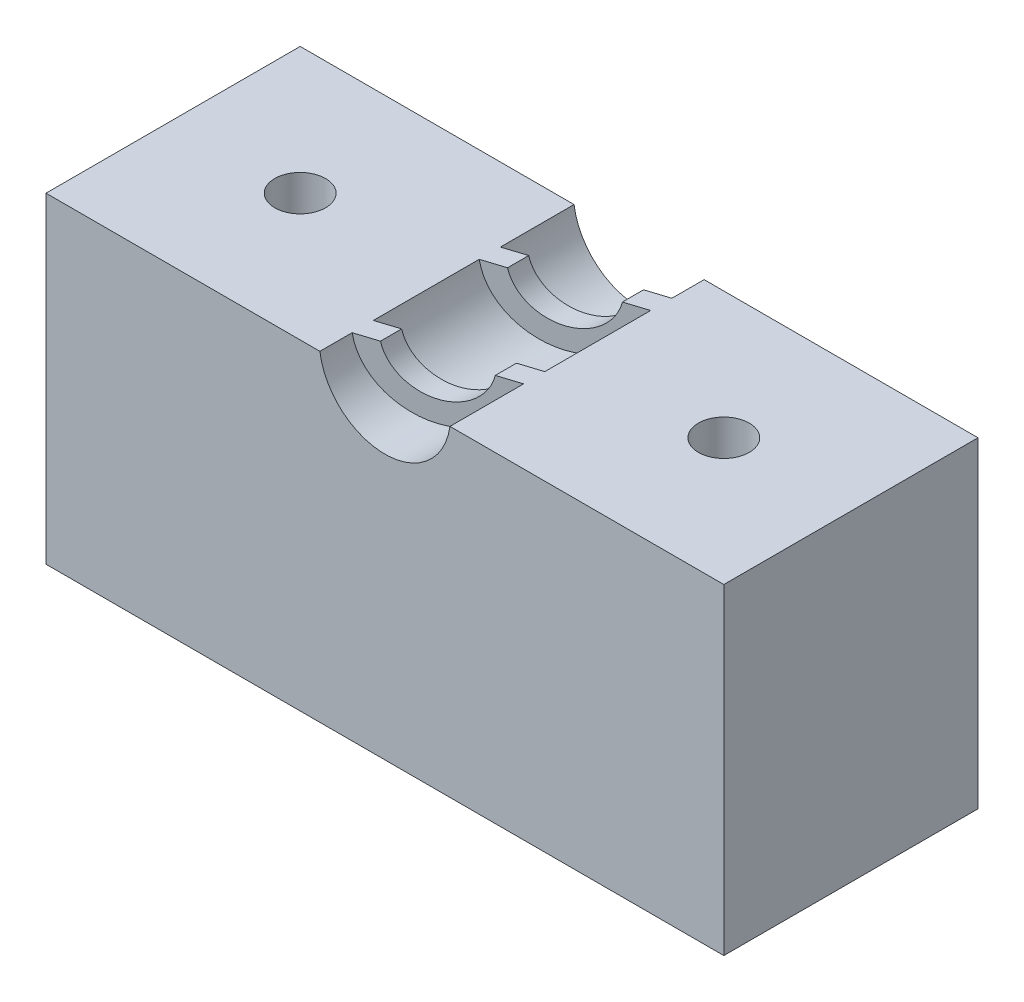
ISO-10303-21;
HEADER;
FILE_DESCRIPTION(('STEP AP214'),'2;1');
FILE_NAME('part.step','',(''),(''),'','','');
FILE_SCHEMA(('AUTOMOTIVE_DESIGN { 1 0 10303 214 1 1 1 1 }'));
ENDSEC;
DATA;
#1=APPLICATION_CONTEXT('core data for automotive mechanical design processes');
#2=APPLICATION_PROTOCOL_DEFINITION('international standard','automotive_design',2000,#1);
#3=PRODUCT_CONTEXT('',#1,'mechanical');
#4=PRODUCT('Part','Part','',(#3));
#5=PRODUCT_RELATED_PRODUCT_CATEGORY('part','',(#4));
#6=PRODUCT_DEFINITION_FORMATION('','',#4);
#7=PRODUCT_DEFINITION_CONTEXT('part definition',#1,'design');
#8=PRODUCT_DEFINITION('design','',#6,#7);
#9=PRODUCT_DEFINITION_SHAPE('','',#8);
#10=(LENGTH_UNIT() NAMED_UNIT(*) SI_UNIT(.MILLI.,.METRE.));
#11=(NAMED_UNIT(*) PLANE_ANGLE_UNIT() SI_UNIT($,.RADIAN.));
#12=(NAMED_UNIT(*) SI_UNIT($,.STERADIAN.) SOLID_ANGLE_UNIT());
#13=UNCERTAINTY_MEASURE_WITH_UNIT(LENGTH_MEASURE(1.E-05),#10,'distance_accuracy_value','');
#14=(GEOMETRIC_REPRESENTATION_CONTEXT(3) GLOBAL_UNCERTAINTY_ASSIGNED_CONTEXT((#13)) GLOBAL_UNIT_ASSIGNED_CONTEXT((#10,
#11,#12)) REPRESENTATION_CONTEXT('',''));
#15=CARTESIAN_POINT('',(0.,0.,0.));
#16=DIRECTION('',(0.,0.,1.));
#17=DIRECTION('',(1.,0.,0.));
#18=AXIS2_PLACEMENT_3D('',#15,#16,#17);
#19=CARTESIAN_POINT('',(0.,0.,3.));
#20=DIRECTION('',(0.,0.,-1.));
#21=DIRECTION('',(-1.,0.,0.));
#22=AXIS2_PLACEMENT_3D('',#19,#20,#21);
#23=PLANE('',#22);
#24=DIRECTION('',(-1.,0.,0.));
#25=VECTOR('',#24,1.);
#26=CARTESIAN_POINT('',(8.,-7.8,3.));
#27=LINE('',#26,#25);
#28=CARTESIAN_POINT('',(8.,-7.8,3.));
#29=VERTEX_POINT('',#28);
#30=CARTESIAN_POINT('',(-8.,-7.8,3.));
#31=VERTEX_POINT('',#30);
#32=EDGE_CURVE('E141',#29,#31,#27,.T.);
#33=ORIENTED_EDGE('',*,*,#32,.F.);
#34=DIRECTION('',(0.,1.,0.));
#35=VECTOR('',#34,1.);
#36=CARTESIAN_POINT('',(8.,-8.,3.));
#37=LINE('',#36,#35);
#38=CARTESIAN_POINT('',(8.,-0.214092960547071,3.));
#39=VERTEX_POINT('',#38);
#40=EDGE_CURVE('E161',#29,#39,#37,.T.);
#41=ORIENTED_EDGE('',*,*,#40,.T.);
#42=DIRECTION('',(1.,0.,0.));
#43=VECTOR('',#42,1.);
#44=CARTESIAN_POINT('',(0.,-0.214092960547071,3.));
#45=LINE('',#44,#43);
#46=CARTESIAN_POINT('',(1.53514305660554,-0.214092960547071,3.));
#47=VERTEX_POINT('',#46);
#48=EDGE_CURVE('E182',#47,#39,#45,.T.);
#49=ORIENTED_EDGE('',*,*,#48,.F.);
#50=CARTESIAN_POINT('',(0.,0.,3.));
#51=DIRECTION('',(0.,0.,1.));
#52=DIRECTION('',(1.,0.,0.));
#53=AXIS2_PLACEMENT_3D('',#50,#51,#52);
#54=CIRCLE('',#53,1.55);
#55=CARTESIAN_POINT('',(-1.53514305660554,-0.214092960547071,3.));
#56=VERTEX_POINT('',#55);
#57=EDGE_CURVE('E165',#56,#47,#54,.T.);
#58=ORIENTED_EDGE('',*,*,#57,.F.);
#59=DIRECTION('',(-1.,0.,0.));
#60=VECTOR('',#59,1.);
#61=CARTESIAN_POINT('',(0.,-0.214092960547071,3.));
#62=LINE('',#61,#60);
#63=CARTESIAN_POINT('',(-8.,-0.214092960547072,3.));
#64=VERTEX_POINT('',#63);
#65=EDGE_CURVE('E188',#56,#64,#62,.T.);
#66=ORIENTED_EDGE('',*,*,#65,.T.);
#67=DIRECTION('',(0.,-1.,0.));
#68=VECTOR('',#67,1.);
#69=CARTESIAN_POINT('',(-8.,-8.,3.));
#70=LINE('',#69,#68);
#71=EDGE_CURVE('E163',#64,#31,#70,.T.);
#72=ORIENTED_EDGE('',*,*,#71,.T.);
#73=EDGE_LOOP('',(#33,#41,#49,#58,#66,#72));
#74=FACE_BOUND('',#73,.T.);
#75=ADVANCED_FACE('F37',(#74),#23,.F.);
#76=CARTESIAN_POINT('',(0.,0.,-3.));
#77=DIRECTION('',(0.,0.,-1.));
#78=DIRECTION('',(-1.,0.,0.));
#79=AXIS2_PLACEMENT_3D('',#76,#77,#78);
#80=PLANE('',#79);
#81=DIRECTION('',(0.,1.,0.));
#82=VECTOR('',#81,1.);
#83=CARTESIAN_POINT('',(8.,-8.,-3.));
#84=LINE('',#83,#82);
#85=CARTESIAN_POINT('',(8.,-7.8,-3.));
#86=VERTEX_POINT('',#85);
#87=CARTESIAN_POINT('',(8.,-0.214092960547071,-3.));
#88=VERTEX_POINT('',#87);
#89=EDGE_CURVE('E155',#86,#88,#84,.T.);
#90=ORIENTED_EDGE('',*,*,#89,.F.);
#91=DIRECTION('',(1.,0.,0.));
#92=VECTOR('',#91,1.);
#93=CARTESIAN_POINT('',(-8.,-7.8,-3.));
#94=LINE('',#93,#92);
#95=CARTESIAN_POINT('',(-8.,-7.8,-3.));
#96=VERTEX_POINT('',#95);
#97=EDGE_CURVE('E54',#96,#86,#94,.T.);
#98=ORIENTED_EDGE('',*,*,#97,.F.);
#99=DIRECTION('',(0.,-1.,0.));
#100=VECTOR('',#99,1.);
#101=CARTESIAN_POINT('',(-8.,-8.,-3.));
#102=LINE('',#101,#100);
#103=CARTESIAN_POINT('',(-8.,-0.214092960547072,-3.));
#104=VERTEX_POINT('',#103);
#105=EDGE_CURVE('E153',#104,#96,#102,.T.);
#106=ORIENTED_EDGE('',*,*,#105,.F.);
#107=DIRECTION('',(-1.,0.,0.));
#108=VECTOR('',#107,1.);
#109=CARTESIAN_POINT('',(0.,-0.214092960547071,-3.));
#110=LINE('',#109,#108);
#111=CARTESIAN_POINT('',(-1.53514305660554,-0.214092960547071,-3.));
#112=VERTEX_POINT('',#111);
#113=EDGE_CURVE('E193',#112,#104,#110,.T.);
#114=ORIENTED_EDGE('',*,*,#113,.F.);
#115=CARTESIAN_POINT('',(0.,0.,-3.));
#116=DIRECTION('',(0.,0.,1.));
#117=DIRECTION('',(1.,0.,0.));
#118=AXIS2_PLACEMENT_3D('',#115,#116,#117);
#119=CIRCLE('',#118,1.55);
#120=CARTESIAN_POINT('',(1.53514305660554,-0.214092960547071,-3.));
#121=VERTEX_POINT('',#120);
#122=EDGE_CURVE('E243',#112,#121,#119,.T.);
#123=ORIENTED_EDGE('',*,*,#122,.T.);
#124=DIRECTION('',(1.,0.,0.));
#125=VECTOR('',#124,1.);
#126=CARTESIAN_POINT('',(0.,-0.214092960547071,-3.));
#127=LINE('',#126,#125);
#128=EDGE_CURVE('E191',#121,#88,#127,.T.);
#129=ORIENTED_EDGE('',*,*,#128,.T.);
#130=EDGE_LOOP('',(#90,#98,#106,#114,#123,#129));
#131=FACE_BOUND('',#130,.T.);
#132=ADVANCED_FACE('F151',(#131),#80,.T.);
#133=CARTESIAN_POINT('',(-8.,-8.,3.));
#134=DIRECTION('',(1.,0.,0.));
#135=DIRECTION('',(0.,0.,-1.));
#136=AXIS2_PLACEMENT_3D('',#133,#134,#135);
#137=PLANE('',#136);
#138=DIRECTION('',(0.,0.,-1.));
#139=VECTOR('',#138,1.);
#140=CARTESIAN_POINT('',(-8.,-7.8,3.));
#141=LINE('',#140,#139);
#142=EDGE_CURVE('E138',#31,#96,#141,.T.);
#143=ORIENTED_EDGE('',*,*,#142,.F.);
#144=ORIENTED_EDGE('',*,*,#71,.F.);
#145=DIRECTION('',(0.,0.,1.));
#146=VECTOR('',#145,1.);
#147=CARTESIAN_POINT('',(-8.,-0.214092960547072,-3.));
#148=LINE('',#147,#146);
#149=EDGE_CURVE('E160',#104,#64,#148,.T.);
#150=ORIENTED_EDGE('',*,*,#149,.F.);
#151=ORIENTED_EDGE('',*,*,#105,.T.);
#152=EDGE_LOOP('',(#143,#144,#150,#151));
#153=FACE_BOUND('',#152,.T.);
#154=ADVANCED_FACE('F159',(#153),#137,.F.);
#155=CARTESIAN_POINT('',(8.,-8.,3.));
#156=DIRECTION('',(-1.,0.,0.));
#157=DIRECTION('',(0.,0.,1.));
#158=AXIS2_PLACEMENT_3D('',#155,#156,#157);
#159=PLANE('',#158);
#160=DIRECTION('',(0.,0.,1.));
#161=VECTOR('',#160,1.);
#162=CARTESIAN_POINT('',(8.,-7.8,-3.));
#163=LINE('',#162,#161);
#164=EDGE_CURVE('E156',#86,#29,#163,.T.);
#165=ORIENTED_EDGE('',*,*,#164,.F.);
#166=ORIENTED_EDGE('',*,*,#89,.T.);
#167=DIRECTION('',(0.,0.,1.));
#168=VECTOR('',#167,1.);
#169=CARTESIAN_POINT('',(8.,-0.214092960547071,-3.));
#170=LINE('',#169,#168);
#171=EDGE_CURVE('E201',#88,#39,#170,.T.);
#172=ORIENTED_EDGE('',*,*,#171,.T.);
#173=ORIENTED_EDGE('',*,*,#40,.F.);
#174=EDGE_LOOP('',(#165,#166,#172,#173));
#175=FACE_BOUND('',#174,.T.);
#176=ADVANCED_FACE('F39',(#175),#159,.F.);
#177=CARTESIAN_POINT('',(5.,-8.,0.));
#178=DIRECTION('',(0.,1.,0.));
#179=DIRECTION('',(0.,0.,1.));
#180=AXIS2_PLACEMENT_3D('',#177,#178,#179);
#181=CYLINDRICAL_SURFACE('',#180,0.6);
#182=CARTESIAN_POINT('',(5.,-0.214092960547071,0.));
#183=DIRECTION('',(0.,-1.,0.));
#184=DIRECTION('',(1.,0.,0.));
#185=AXIS2_PLACEMENT_3D('',#182,#183,#184);
#186=CIRCLE('',#185,0.6);
#187=CARTESIAN_POINT('',(5.6,-0.214092960547071,0.));
#188=VERTEX_POINT('',#187);
#189=EDGE_CURVE('E177',#188,#188,#186,.T.);
#190=ORIENTED_EDGE('',*,*,#189,.F.);
#191=EDGE_LOOP('',(#190));
#192=FACE_BOUND('',#191,.T.);
#193=CARTESIAN_POINT('',(5.,-7.8,0.));
#194=DIRECTION('',(0.,-1.,0.));
#195=DIRECTION('',(0.,0.,-1.));
#196=AXIS2_PLACEMENT_3D('',#193,#194,#195);
#197=CIRCLE('',#196,0.6);
#198=CARTESIAN_POINT('',(5.,-7.8,-0.600000000000001));
#199=VERTEX_POINT('',#198);
#200=EDGE_CURVE('E444',#199,#199,#197,.T.);
#201=ORIENTED_EDGE('',*,*,#200,.T.);
#202=EDGE_LOOP('',(#201));
#203=FACE_BOUND('',#202,.T.);
#204=ADVANCED_FACE('F316',(#192,#203),#181,.F.);
#205=CARTESIAN_POINT('',(-5.,-8.,0.));
#206=DIRECTION('',(0.,1.,0.));
#207=DIRECTION('',(0.,0.,1.));
#208=AXIS2_PLACEMENT_3D('',#205,#206,#207);
#209=CYLINDRICAL_SURFACE('',#208,0.6);
#210=CARTESIAN_POINT('',(-5.,-0.214092960547072,0.));
#211=DIRECTION('',(0.,1.,0.));
#212=DIRECTION('',(-1.,0.,0.));
#213=AXIS2_PLACEMENT_3D('',#210,#211,#212);
#214=CIRCLE('',#213,0.6);
#215=CARTESIAN_POINT('',(-5.6,-0.214092960547072,0.));
#216=VERTEX_POINT('',#215);
#217=EDGE_CURVE('E41',#216,#216,#214,.T.);
#218=ORIENTED_EDGE('',*,*,#217,.T.);
#219=EDGE_LOOP('',(#218));
#220=FACE_BOUND('',#219,.T.);
#221=CARTESIAN_POINT('',(-5.,-7.8,0.));
#222=DIRECTION('',(0.,-1.,0.));
#223=DIRECTION('',(0.,0.,-1.));
#224=AXIS2_PLACEMENT_3D('',#221,#222,#223);
#225=CIRCLE('',#224,0.6);
#226=CARTESIAN_POINT('',(-5.,-7.8,-0.6));
#227=VERTEX_POINT('',#226);
#228=EDGE_CURVE('E146',#227,#227,#225,.T.);
#229=ORIENTED_EDGE('',*,*,#228,.T.);
#230=EDGE_LOOP('',(#229));
#231=FACE_BOUND('',#230,.T.);
#232=ADVANCED_FACE('F320',(#220,#231),#209,.F.);
#233=CARTESIAN_POINT('',(0.,0.,3.));
#234=DIRECTION('',(0.,0.,-1.));
#235=DIRECTION('',(-1.,0.,0.));
#236=AXIS2_PLACEMENT_3D('',#233,#234,#235);
#237=CYLINDRICAL_SURFACE('',#236,1.55);
#238=ORIENTED_EDGE('',*,*,#122,.F.);
#239=DIRECTION('',(0.,0.,-1.));
#240=VECTOR('',#239,1.);
#241=CARTESIAN_POINT('',(-1.53514305660554,-0.214092960547071,3.));
#242=LINE('',#241,#240);
#243=CARTESIAN_POINT('',(-1.53514305660554,-0.214092960547072,-1.26125398185195));
#244=VERTEX_POINT('',#243);
#245=EDGE_CURVE('E217',#112,#244,#242,.F.);
#246=ORIENTED_EDGE('',*,*,#245,.T.);
#247=CARTESIAN_POINT('',(0.,0.,-1.75));
#248=DIRECTION('',(-0.303367903708314,0.,-0.952873504196451));
#249=DIRECTION('',(0.952873504196451,0.,-0.303367903708314));
#250=AXIS2_PLACEMENT_3D('',#247,#248,#249);
#251=ELLIPSE('',#250,1.62665872560608,1.55);
#252=CARTESIAN_POINT('',(1.53514305660553,-0.214092960547071,-2.23874601814805));
#253=VERTEX_POINT('',#252);
#254=EDGE_CURVE('E237',#253,#244,#251,.T.);
#255=ORIENTED_EDGE('',*,*,#254,.F.);
#256=DIRECTION('',(0.,0.,-1.));
#257=VECTOR('',#256,1.);
#258=CARTESIAN_POINT('',(1.53514305660554,-0.214092960547071,3.));
#259=LINE('',#258,#257);
#260=EDGE_CURVE('E206',#121,#253,#259,.F.);
#261=ORIENTED_EDGE('',*,*,#260,.F.);
#262=EDGE_LOOP('',(#238,#246,#255,#261));
#263=FACE_BOUND('',#262,.T.);
#264=ADVANCED_FACE('F281',(#263),#237,.F.);
#265=CARTESIAN_POINT('',(0.,0.,1.75));
#266=DIRECTION('',(0.303367903708314,0.,0.952873504196451));
#267=DIRECTION('',(0.952873504196451,0.,-0.303367903708314));
#268=AXIS2_PLACEMENT_3D('',#265,#266,#267);
#269=ELLIPSE('',#268,1.62665872560608,1.55);
#270=CARTESIAN_POINT('',(-1.53514305660554,-0.214092960547072,2.23874601814805));
#271=VERTEX_POINT('',#270);
#272=CARTESIAN_POINT('',(1.53514305660553,-0.214092960547071,1.26125398185195));
#273=VERTEX_POINT('',#272);
#274=EDGE_CURVE('E169',#271,#273,#269,.T.);
#275=ORIENTED_EDGE('',*,*,#274,.F.);
#276=EDGE_CURVE('E221',#271,#56,#242,.F.);
#277=ORIENTED_EDGE('',*,*,#276,.T.);
#278=ORIENTED_EDGE('',*,*,#57,.T.);
#279=EDGE_CURVE('E209',#273,#47,#259,.F.);
#280=ORIENTED_EDGE('',*,*,#279,.F.);
#281=EDGE_LOOP('',(#275,#277,#278,#280));
#282=FACE_BOUND('',#281,.T.);
#283=ADVANCED_FACE('F256',(#282),#237,.F.);
#284=CARTESIAN_POINT('',(0.505874665567726,-11.4381719755756,1.58894385124934));
#285=DIRECTION('',(0.303367903708314,0.,0.952873504196451));
#286=DIRECTION('',(0.952873504196451,0.,-0.303367903708314));
#287=AXIS2_PLACEMENT_3D('',#284,#285,#286);
#288=PLANE('',#287);
#289=CARTESIAN_POINT('',(0.,0.,1.75));
#290=DIRECTION('',(0.303367903708314,0.,0.952873504196451));
#291=DIRECTION('',(-0.952873504196451,0.,0.303367903708314));
#292=AXIS2_PLACEMENT_3D('',#289,#290,#291);
#293=ELLIPSE('',#292,1.10193010444283,1.05);
#294=CARTESIAN_POINT('',(-1.02794173193046,-0.214092960547071,2.07726749875684));
#295=VERTEX_POINT('',#294);
#296=CARTESIAN_POINT('',(1.02794173193046,-0.214092960547071,1.42273250124316));
#297=VERTEX_POINT('',#296);
#298=EDGE_CURVE('E232',#295,#297,#293,.T.);
#299=ORIENTED_EDGE('',*,*,#298,.F.);
#300=DIRECTION('',(-0.952873504196451,0.,0.303367903708314));
#301=VECTOR('',#300,1.);
#302=CARTESIAN_POINT('',(0.505874665567725,-0.214092960547071,1.58894385124934));
#303=LINE('',#302,#301);
#304=EDGE_CURVE('E227',#295,#271,#303,.T.);
#305=ORIENTED_EDGE('',*,*,#304,.T.);
#306=ORIENTED_EDGE('',*,*,#274,.T.);
#307=DIRECTION('',(0.952873504196451,0.,-0.303367903708314));
#308=VECTOR('',#307,1.);
#309=CARTESIAN_POINT('',(0.505874665567726,-0.214092960547071,1.58894385124934));
#310=LINE('',#309,#308);
#311=EDGE_CURVE('E215',#297,#273,#310,.T.);
#312=ORIENTED_EDGE('',*,*,#311,.F.);
#313=EDGE_LOOP('',(#299,#305,#306,#312));
#314=FACE_BOUND('',#313,.T.);
#315=ADVANCED_FACE('F275',(#314),#288,.T.);
#316=CARTESIAN_POINT('',(-0.505874665567727,-11.4381719755756,-1.58894385124934));
#317=DIRECTION('',(-0.303367903708314,0.,-0.952873504196451));
#318=DIRECTION('',(-0.952873504196451,0.,0.303367903708314));
#319=AXIS2_PLACEMENT_3D('',#316,#317,#318);
#320=PLANE('',#319);
#321=ORIENTED_EDGE('',*,*,#254,.T.);
#322=DIRECTION('',(0.952873504196451,0.,-0.303367903708314));
#323=VECTOR('',#322,1.);
#324=CARTESIAN_POINT('',(-0.505874665567728,-0.214092960547071,-1.58894385124934));
#325=LINE('',#324,#323);
#326=CARTESIAN_POINT('',(-1.02794173193046,-0.214092960547071,-1.42273250124316));
#327=VERTEX_POINT('',#326);
#328=EDGE_CURVE('E11',#244,#327,#325,.T.);
#329=ORIENTED_EDGE('',*,*,#328,.T.);
#330=CARTESIAN_POINT('',(0.,0.,-1.75));
#331=DIRECTION('',(-0.303367903708314,0.,-0.952873504196451));
#332=DIRECTION('',(-0.952873504196451,0.,0.303367903708314));
#333=AXIS2_PLACEMENT_3D('',#330,#331,#332);
#334=ELLIPSE('',#333,1.10193010444283,1.05);
#335=CARTESIAN_POINT('',(1.02794173193046,-0.214092960547071,-2.07726749875684));
#336=VERTEX_POINT('',#335);
#337=EDGE_CURVE('E46',#336,#327,#334,.T.);
#338=ORIENTED_EDGE('',*,*,#337,.F.);
#339=DIRECTION('',(-0.952873504196451,0.,0.303367903708314));
#340=VECTOR('',#339,1.);
#341=CARTESIAN_POINT('',(-0.505874665567727,-0.214092960547071,-1.58894385124934));
#342=LINE('',#341,#340);
#343=EDGE_CURVE('E175',#253,#336,#342,.T.);
#344=ORIENTED_EDGE('',*,*,#343,.F.);
#345=EDGE_LOOP('',(#321,#329,#338,#344));
#346=FACE_BOUND('',#345,.T.);
#347=ADVANCED_FACE('F286',(#346),#320,.T.);
#348=CARTESIAN_POINT('',(0.,0.,-3.));
#349=DIRECTION('',(0.,0.,1.));
#350=DIRECTION('',(1.,0.,0.));
#351=AXIS2_PLACEMENT_3D('',#348,#349,#350);
#352=CYLINDRICAL_SURFACE('',#351,1.05);
#353=DIRECTION('',(0.,0.,1.));
#354=VECTOR('',#353,1.);
#355=CARTESIAN_POINT('',(-1.02794173193046,-0.214092960547071,-3.));
#356=LINE('',#355,#354);
#357=CARTESIAN_POINT('',(-1.02794173193046,-0.214092960547071,1.57726749875684));
#358=VERTEX_POINT('',#357);
#359=EDGE_CURVE('E196',#358,#295,#356,.T.);
#360=ORIENTED_EDGE('',*,*,#359,.T.);
#361=ORIENTED_EDGE('',*,*,#298,.T.);
#362=DIRECTION('',(0.,0.,1.));
#363=VECTOR('',#362,1.);
#364=CARTESIAN_POINT('',(1.02794173193046,-0.214092960547071,-3.));
#365=LINE('',#364,#363);
#366=CARTESIAN_POINT('',(1.02794173193046,-0.214092960547071,0.92273250124316));
#367=VERTEX_POINT('',#366);
#368=EDGE_CURVE('E195',#367,#297,#365,.T.);
#369=ORIENTED_EDGE('',*,*,#368,.F.);
#370=CARTESIAN_POINT('',(0.,0.,1.25));
#371=DIRECTION('',(0.303367903708314,0.,0.952873504196451));
#372=DIRECTION('',(-0.952873504196451,0.,0.303367903708314));
#373=AXIS2_PLACEMENT_3D('',#370,#371,#372);
#374=ELLIPSE('',#373,1.10193010444283,1.05);
#375=EDGE_CURVE('E234',#358,#367,#374,.T.);
#376=ORIENTED_EDGE('',*,*,#375,.F.);
#377=EDGE_LOOP('',(#360,#361,#369,#376));
#378=FACE_BOUND('',#377,.T.);
#379=ADVANCED_FACE('F271',(#378),#352,.F.);
#380=CARTESIAN_POINT('',(0.,-0.214092960547071,-3.));
#381=DIRECTION('',(0.,1.,0.));
#382=DIRECTION('',(-1.,0.,0.));
#383=AXIS2_PLACEMENT_3D('',#380,#381,#382);
#384=PLANE('',#383);
#385=ORIENTED_EDGE('',*,*,#217,.F.);
#386=EDGE_LOOP('',(#385));
#387=FACE_BOUND('',#386,.T.);
#388=ORIENTED_EDGE('',*,*,#304,.F.);
#389=ORIENTED_EDGE('',*,*,#359,.F.);
#390=DIRECTION('',(-0.952873504196451,0.,0.303367903708314));
#391=VECTOR('',#390,1.);
#392=CARTESIAN_POINT('',(0.361339046834089,-0.214092960547071,1.13495989374953));
#393=LINE('',#392,#391);
#394=CARTESIAN_POINT('',(-1.53514305660554,-0.214092960547071,1.73874601814805));
#395=VERTEX_POINT('',#394);
#396=EDGE_CURVE('E225',#358,#395,#393,.T.);
#397=ORIENTED_EDGE('',*,*,#396,.T.);
#398=CARTESIAN_POINT('',(-1.53514305660554,-0.214092960547072,-0.76125398185195));
#399=VERTEX_POINT('',#398);
#400=EDGE_CURVE('E222',#399,#395,#242,.F.);
#401=ORIENTED_EDGE('',*,*,#400,.F.);
#402=DIRECTION('',(-0.952873504196451,0.,0.303367903708314));
#403=VECTOR('',#402,1.);
#404=CARTESIAN_POINT('',(-0.361339046834092,-0.214092960547071,-1.13495989374953));
#405=LINE('',#404,#403);
#406=CARTESIAN_POINT('',(-1.02794173193046,-0.214092960547071,-0.922732501243162));
#407=VERTEX_POINT('',#406);
#408=EDGE_CURVE('E220',#407,#399,#405,.T.);
#409=ORIENTED_EDGE('',*,*,#408,.F.);
#410=EDGE_CURVE('E199',#327,#407,#356,.T.);
#411=ORIENTED_EDGE('',*,*,#410,.F.);
#412=ORIENTED_EDGE('',*,*,#328,.F.);
#413=ORIENTED_EDGE('',*,*,#245,.F.);
#414=ORIENTED_EDGE('',*,*,#113,.T.);
#415=ORIENTED_EDGE('',*,*,#149,.T.);
#416=ORIENTED_EDGE('',*,*,#65,.F.);
#417=ORIENTED_EDGE('',*,*,#276,.F.);
#418=EDGE_LOOP('',(#388,#389,#397,#401,#409,#411,#412,#413,#414,#415,#416,#417));
#419=FACE_BOUND('',#418,.T.);
#420=ADVANCED_FACE('F253',(#387,#419),#384,.T.);
#421=CARTESIAN_POINT('',(0.,-0.214092960547071,-3.));
#422=DIRECTION('',(0.,-1.,0.));
#423=DIRECTION('',(1.,0.,0.));
#424=AXIS2_PLACEMENT_3D('',#421,#422,#423);
#425=PLANE('',#424);
#426=ORIENTED_EDGE('',*,*,#189,.T.);
#427=EDGE_LOOP('',(#426));
#428=FACE_BOUND('',#427,.T.);
#429=ORIENTED_EDGE('',*,*,#279,.T.);
#430=ORIENTED_EDGE('',*,*,#48,.T.);
#431=ORIENTED_EDGE('',*,*,#171,.F.);
#432=ORIENTED_EDGE('',*,*,#128,.F.);
#433=ORIENTED_EDGE('',*,*,#260,.T.);
#434=ORIENTED_EDGE('',*,*,#343,.T.);
#435=CARTESIAN_POINT('',(1.02794173193046,-0.214092960547071,-1.57726749875684));
#436=VERTEX_POINT('',#435);
#437=EDGE_CURVE('E62',#336,#436,#365,.T.);
#438=ORIENTED_EDGE('',*,*,#437,.T.);
#439=DIRECTION('',(0.952873504196451,0.,-0.303367903708314));
#440=VECTOR('',#439,1.);
#441=CARTESIAN_POINT('',(-0.361339046834091,-0.214092960547071,-1.13495989374953));
#442=LINE('',#441,#440);
#443=CARTESIAN_POINT('',(1.53514305660554,-0.214092960547071,-1.73874601814805));
#444=VERTEX_POINT('',#443);
#445=EDGE_CURVE('E208',#436,#444,#442,.T.);
#446=ORIENTED_EDGE('',*,*,#445,.T.);
#447=CARTESIAN_POINT('',(1.53514305660554,-0.214092960547071,0.761253981851949));
#448=VERTEX_POINT('',#447);
#449=EDGE_CURVE('E210',#444,#448,#259,.F.);
#450=ORIENTED_EDGE('',*,*,#449,.T.);
#451=DIRECTION('',(0.952873504196451,0.,-0.303367903708314));
#452=VECTOR('',#451,1.);
#453=CARTESIAN_POINT('',(0.36133904683409,-0.214092960547071,1.13495989374953));
#454=LINE('',#453,#452);
#455=EDGE_CURVE('E212',#367,#448,#454,.T.);
#456=ORIENTED_EDGE('',*,*,#455,.F.);
#457=ORIENTED_EDGE('',*,*,#368,.T.);
#458=ORIENTED_EDGE('',*,*,#311,.T.);
#459=EDGE_LOOP('',(#429,#430,#431,#432,#433,#434,#438,#446,#450,#456,#457,#458));
#460=FACE_BOUND('',#459,.T.);
#461=ADVANCED_FACE('F268',(#428,#460),#425,.F.);
#462=CARTESIAN_POINT('',(0.,0.,-1.25));
#463=DIRECTION('',(0.303367903708314,0.,0.952873504196451));
#464=DIRECTION('',(-0.952873504196451,0.,0.303367903708314));
#465=AXIS2_PLACEMENT_3D('',#462,#463,#464);
#466=ELLIPSE('',#465,1.10193010444283,1.05);
#467=EDGE_CURVE('E230',#407,#436,#466,.T.);
#468=ORIENTED_EDGE('',*,*,#467,.T.);
#469=ORIENTED_EDGE('',*,*,#437,.F.);
#470=ORIENTED_EDGE('',*,*,#337,.T.);
#471=ORIENTED_EDGE('',*,*,#410,.T.);
#472=EDGE_LOOP('',(#468,#469,#470,#471));
#473=FACE_BOUND('',#472,.T.);
#474=ADVANCED_FACE('F290',(#473),#352,.F.);
#475=CARTESIAN_POINT('',(0.36133904683409,-11.4381719755756,1.13495989374953));
#476=DIRECTION('',(0.303367903708314,0.,0.952873504196451));
#477=DIRECTION('',(0.952873504196451,0.,-0.303367903708314));
#478=AXIS2_PLACEMENT_3D('',#475,#476,#477);
#479=PLANE('',#478);
#480=ORIENTED_EDGE('',*,*,#396,.F.);
#481=ORIENTED_EDGE('',*,*,#375,.T.);
#482=ORIENTED_EDGE('',*,*,#455,.T.);
#483=CARTESIAN_POINT('',(0.,0.,1.25));
#484=DIRECTION('',(0.303367903708314,0.,0.952873504196451));
#485=DIRECTION('',(0.952873504196451,0.,-0.303367903708314));
#486=AXIS2_PLACEMENT_3D('',#483,#484,#485);
#487=ELLIPSE('',#486,1.62665872560608,1.55);
#488=EDGE_CURVE('E172',#395,#448,#487,.T.);
#489=ORIENTED_EDGE('',*,*,#488,.F.);
#490=EDGE_LOOP('',(#480,#481,#482,#489));
#491=FACE_BOUND('',#490,.T.);
#492=ADVANCED_FACE('F266',(#491),#479,.F.);
#493=CARTESIAN_POINT('',(-0.361339046834091,-11.4381719755756,-1.13495989374953));
#494=DIRECTION('',(0.303367903708314,0.,0.952873504196451));
#495=DIRECTION('',(0.952873504196451,0.,-0.303367903708314));
#496=AXIS2_PLACEMENT_3D('',#493,#494,#495);
#497=PLANE('',#496);
#498=ORIENTED_EDGE('',*,*,#467,.F.);
#499=ORIENTED_EDGE('',*,*,#408,.T.);
#500=CARTESIAN_POINT('',(0.,0.,-1.25));
#501=DIRECTION('',(0.303367903708314,0.,0.952873504196451));
#502=DIRECTION('',(0.952873504196451,0.,-0.303367903708314));
#503=AXIS2_PLACEMENT_3D('',#500,#501,#502);
#504=ELLIPSE('',#503,1.62665872560608,1.55);
#505=EDGE_CURVE('E240',#399,#444,#504,.T.);
#506=ORIENTED_EDGE('',*,*,#505,.T.);
#507=ORIENTED_EDGE('',*,*,#445,.F.);
#508=EDGE_LOOP('',(#498,#499,#506,#507));
#509=FACE_BOUND('',#508,.T.);
#510=ADVANCED_FACE('F293',(#509),#497,.T.);
#511=ORIENTED_EDGE('',*,*,#505,.F.);
#512=ORIENTED_EDGE('',*,*,#400,.T.);
#513=ORIENTED_EDGE('',*,*,#488,.T.);
#514=ORIENTED_EDGE('',*,*,#449,.F.);
#515=EDGE_LOOP('',(#511,#512,#513,#514));
#516=FACE_BOUND('',#515,.T.);
#517=ADVANCED_FACE('F262',(#516),#237,.F.);
#518=CARTESIAN_POINT('',(0.,-7.8,0.));
#519=DIRECTION('',(0.,-1.,0.));
#520=DIRECTION('',(0.,0.,-1.));
#521=AXIS2_PLACEMENT_3D('',#518,#519,#520);
#522=PLANE('',#521);
#523=ORIENTED_EDGE('',*,*,#200,.F.);
#524=EDGE_LOOP('',(#523));
#525=FACE_BOUND('',#524,.T.);
#526=ORIENTED_EDGE('',*,*,#228,.F.);
#527=EDGE_LOOP('',(#526));
#528=FACE_BOUND('',#527,.T.);
#529=ORIENTED_EDGE('',*,*,#142,.T.);
#530=ORIENTED_EDGE('',*,*,#97,.T.);
#531=ORIENTED_EDGE('',*,*,#164,.T.);
#532=ORIENTED_EDGE('',*,*,#32,.T.);
#533=EDGE_LOOP('',(#529,#530,#531,#532));
#534=FACE_BOUND('',#533,.T.);
#535=ADVANCED_FACE('F139',(#525,#528,#534),#522,.T.);
#536=CLOSED_SHELL('',(#75,#132,#154,#176,#204,#232,#264,#283,#315,#347,#379,#420,#461,#474,#492,
#510,#517,#535));
#537=MANIFOLD_SOLID_BREP('B2',#536);
#538=ADVANCED_BREP_SHAPE_REPRESENTATION('',(#18,#537),#14);
#539=SHAPE_DEFINITION_REPRESENTATION(#9,#538);
ENDSEC;
END-ISO-10303-21;
